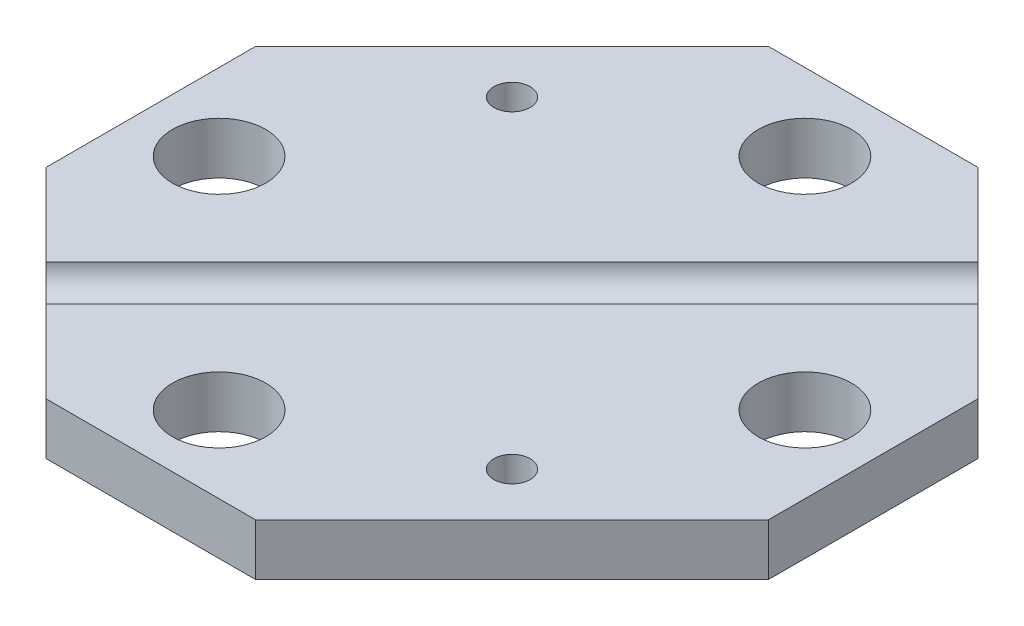
ISO-10303-21;
HEADER;
FILE_DESCRIPTION(('STEP AP214'),'2;1');
FILE_NAME('part.step','',(''),(''),'','','');
FILE_SCHEMA(('AUTOMOTIVE_DESIGN { 1 0 10303 214 1 1 1 1 }'));
ENDSEC;
DATA;
#1=APPLICATION_CONTEXT('core data for automotive mechanical design processes');
#2=APPLICATION_PROTOCOL_DEFINITION('international standard','automotive_design',2000,#1);
#3=PRODUCT_CONTEXT('',#1,'mechanical');
#4=PRODUCT('Part','Part','',(#3));
#5=PRODUCT_RELATED_PRODUCT_CATEGORY('part','',(#4));
#6=PRODUCT_DEFINITION_FORMATION('','',#4);
#7=PRODUCT_DEFINITION_CONTEXT('part definition',#1,'design');
#8=PRODUCT_DEFINITION('design','',#6,#7);
#9=PRODUCT_DEFINITION_SHAPE('','',#8);
#10=(LENGTH_UNIT() NAMED_UNIT(*) SI_UNIT(.MILLI.,.METRE.));
#11=(NAMED_UNIT(*) PLANE_ANGLE_UNIT() SI_UNIT($,.RADIAN.));
#12=(NAMED_UNIT(*) SI_UNIT($,.STERADIAN.) SOLID_ANGLE_UNIT());
#13=UNCERTAINTY_MEASURE_WITH_UNIT(LENGTH_MEASURE(1.E-05),#10,'distance_accuracy_value','');
#14=(GEOMETRIC_REPRESENTATION_CONTEXT(3) GLOBAL_UNCERTAINTY_ASSIGNED_CONTEXT((#13)) GLOBAL_UNIT_ASSIGNED_CONTEXT((#10,
#11,#12)) REPRESENTATION_CONTEXT('',''));
#15=CARTESIAN_POINT('',(0.,0.,0.));
#16=DIRECTION('',(0.,0.,1.));
#17=DIRECTION('',(1.,0.,0.));
#18=AXIS2_PLACEMENT_3D('',#15,#16,#17);
#19=CARTESIAN_POINT('',(0.,5.,0.));
#20=DIRECTION('',(0.,-1.,0.));
#21=DIRECTION('',(0.,0.,-1.));
#22=AXIS2_PLACEMENT_3D('',#19,#20,#21);
#23=PLANE('',#22);
#24=CARTESIAN_POINT('',(-23.6869337565123,5.,-23.6869337565124));
#25=DIRECTION('',(0.,1.,0.));
#26=DIRECTION('',(0.,0.,1.));
#27=AXIS2_PLACEMENT_3D('',#24,#25,#26);
#28=CIRCLE('',#27,1.75000000000001);
#29=CARTESIAN_POINT('',(-23.6869337565123,5.,-21.9369337565123));
#30=VERTEX_POINT('',#29);
#31=EDGE_CURVE('E254',#30,#30,#28,.T.);
#32=ORIENTED_EDGE('',*,*,#31,.F.);
#33=EDGE_LOOP('',(#32));
#34=FACE_BOUND('',#33,.T.);
#35=CARTESIAN_POINT('',(-32.8793219119375,5.,-4.59505066447559));
#36=DIRECTION('',(0.,1.,0.));
#37=DIRECTION('',(0.,0.,1.));
#38=AXIS2_PLACEMENT_3D('',#35,#36,#37);
#39=CIRCLE('',#38,4.5);
#40=CARTESIAN_POINT('',(-32.8793219119375,5.,-0.0950506644755884));
#41=VERTEX_POINT('',#40);
#42=EDGE_CURVE('E274',#41,#41,#39,.T.);
#43=ORIENTED_EDGE('',*,*,#42,.F.);
#44=EDGE_LOOP('',(#43));
#45=FACE_BOUND('',#44,.T.);
#46=CARTESIAN_POINT('',(-4.59505066447554,5.,-32.8793219119374));
#47=DIRECTION('',(0.,1.,0.));
#48=DIRECTION('',(0.,0.,1.));
#49=AXIS2_PLACEMENT_3D('',#46,#47,#48);
#50=CIRCLE('',#49,4.5);
#51=CARTESIAN_POINT('',(-4.59505066447554,5.,-28.3793219119374));
#52=VERTEX_POINT('',#51);
#53=EDGE_CURVE('E280',#52,#52,#50,.T.);
#54=ORIENTED_EDGE('',*,*,#53,.F.);
#55=EDGE_LOOP('',(#54));
#56=FACE_BOUND('',#55,.T.);
#57=DIRECTION('',(0.707106781186547,0.,0.707106781186549));
#58=VECTOR('',#57,1.);
#59=CARTESIAN_POINT('',(-40.3039431143962,5.,4.69479422713291));
#60=LINE('',#59,#58);
#61=CARTESIAN_POINT('',(-40.3039431143962,5.,4.69479422713291));
#62=VERTEX_POINT('',#61);
#63=CARTESIAN_POINT('',(-32.3977201941393,5.,12.6010171473899));
#64=VERTEX_POINT('',#63);
#65=EDGE_CURVE('E303',#62,#64,#60,.T.);
#66=ORIENTED_EDGE('',*,*,#65,.T.);
#67=DIRECTION('',(0.707106781186549,0.,-0.707106781186546));
#68=VECTOR('',#67,1.);
#69=CARTESIAN_POINT('',(-42.0727100673626,5.,22.2760070206132));
#70=LINE('',#69,#68);
#71=CARTESIAN_POINT('',(12.60101714739,5.,-32.3977201941392));
#72=VERTEX_POINT('',#71);
#73=EDGE_CURVE('E269',#64,#72,#70,.T.);
#74=ORIENTED_EDGE('',*,*,#73,.T.);
#75=DIRECTION('',(-0.707106781186546,0.,-0.707106781186549));
#76=VECTOR('',#75,1.);
#77=CARTESIAN_POINT('',(4.69479422713301,5.,-40.3039431143962));
#78=LINE('',#77,#76);
#79=CARTESIAN_POINT('',(4.69479422713301,5.,-40.3039431143962));
#80=VERTEX_POINT('',#79);
#81=EDGE_CURVE('E312',#72,#80,#78,.T.);
#82=ORIENTED_EDGE('',*,*,#81,.T.);
#83=DIRECTION('',(-1.,0.,0.));
#84=VECTOR('',#83,1.);
#85=CARTESIAN_POINT('',(-15.555205772867,5.,-40.3039431143962));
#86=LINE('',#85,#84);
#87=CARTESIAN_POINT('',(-15.555205772867,5.,-40.3039431143962));
#88=VERTEX_POINT('',#87);
#89=EDGE_CURVE('E316',#80,#88,#86,.T.);
#90=ORIENTED_EDGE('',*,*,#89,.T.);
#91=DIRECTION('',(-0.707106781186549,0.,0.707106781186546));
#92=VECTOR('',#91,1.);
#93=CARTESIAN_POINT('',(-40.3039431143962,5.,-15.5552057728671));
#94=LINE('',#93,#92);
#95=CARTESIAN_POINT('',(-40.3039431143962,5.,-15.5552057728671));
#96=VERTEX_POINT('',#95);
#97=EDGE_CURVE('E318',#88,#96,#94,.T.);
#98=ORIENTED_EDGE('',*,*,#97,.T.);
#99=DIRECTION('',(0.,0.,1.));
#100=VECTOR('',#99,1.);
#101=CARTESIAN_POINT('',(-40.3039431143962,5.,-15.5552057728671));
#102=LINE('',#101,#100);
#103=EDGE_CURVE('E298',#96,#62,#102,.T.);
#104=ORIENTED_EDGE('',*,*,#103,.T.);
#105=EDGE_LOOP('',(#66,#74,#82,#90,#98,#104));
#106=FACE_BOUND('',#105,.T.);
#107=ADVANCED_FACE('F45',(#34,#45,#56,#106),#23,.F.);
#108=CARTESIAN_POINT('',(7.42576461569574,5.,7.42576461569574));
#109=DIRECTION('',(0.,1.,0.));
#110=DIRECTION('',(0.,0.,1.));
#111=AXIS2_PLACEMENT_3D('',#108,#109,#110);
#112=CIRCLE('',#111,1.75);
#113=CARTESIAN_POINT('',(7.42576461569574,5.,9.17576461569574));
#114=VERTEX_POINT('',#113);
#115=EDGE_CURVE('E242',#114,#114,#112,.T.);
#116=ORIENTED_EDGE('',*,*,#115,.F.);
#117=EDGE_LOOP('',(#116));
#118=FACE_BOUND('',#117,.T.);
#119=CARTESIAN_POINT('',(24.0427739735796,5.,-20.9559633679495));
#120=VERTEX_POINT('',#119);
#121=CARTESIAN_POINT('',(16.1365510533227,5.,-28.8621862882065));
#122=VERTEX_POINT('',#121);
#123=EDGE_CURVE('E313',#120,#122,#78,.T.);
#124=ORIENTED_EDGE('',*,*,#123,.T.);
#125=DIRECTION('',(0.707106781186549,0.,-0.707106781186546));
#126=VECTOR('',#125,1.);
#127=CARTESIAN_POINT('',(-38.5371761614299,5.,25.8115409265459));
#128=LINE('',#127,#126);
#129=CARTESIAN_POINT('',(-28.8621862882066,5.,16.1365510533226));
#130=VERTEX_POINT('',#129);
#131=EDGE_CURVE('E68',#130,#122,#128,.T.);
#132=ORIENTED_EDGE('',*,*,#131,.F.);
#133=CARTESIAN_POINT('',(-20.9559633679496,5.,24.0427739735796));
#134=VERTEX_POINT('',#133);
#135=EDGE_CURVE('E301',#130,#134,#60,.T.);
#136=ORIENTED_EDGE('',*,*,#135,.T.);
#137=DIRECTION('',(1.,0.,0.));
#138=VECTOR('',#137,1.);
#139=CARTESIAN_POINT('',(-0.705963367949583,5.,24.0427739735796));
#140=LINE('',#139,#138);
#141=CARTESIAN_POINT('',(-0.705963367949583,5.,24.0427739735796));
#142=VERTEX_POINT('',#141);
#143=EDGE_CURVE('E306',#134,#142,#140,.T.);
#144=ORIENTED_EDGE('',*,*,#143,.T.);
#145=DIRECTION('',(0.707106781186549,0.,-0.707106781186546));
#146=VECTOR('',#145,1.);
#147=CARTESIAN_POINT('',(-0.705963367949583,5.,24.0427739735796));
#148=LINE('',#147,#146);
#149=CARTESIAN_POINT('',(24.0427739735796,5.,-0.705963367949539));
#150=VERTEX_POINT('',#149);
#151=EDGE_CURVE('E308',#142,#150,#148,.T.);
#152=ORIENTED_EDGE('',*,*,#151,.T.);
#153=DIRECTION('',(0.,0.,-1.));
#154=VECTOR('',#153,1.);
#155=CARTESIAN_POINT('',(24.0427739735796,5.,-0.705963367949539));
#156=LINE('',#155,#154);
#157=EDGE_CURVE('E310',#150,#120,#156,.T.);
#158=ORIENTED_EDGE('',*,*,#157,.T.);
#159=EDGE_LOOP('',(#124,#132,#136,#144,#152,#158));
#160=FACE_BOUND('',#159,.T.);
#161=CARTESIAN_POINT('',(-11.6661184763411,5.,16.6181527711208));
#162=DIRECTION('',(0.,1.,0.));
#163=DIRECTION('',(0.,0.,1.));
#164=AXIS2_PLACEMENT_3D('',#161,#162,#163);
#165=CIRCLE('',#164,4.5);
#166=CARTESIAN_POINT('',(-11.6661184763411,5.,21.1181527711208));
#167=VERTEX_POINT('',#166);
#168=EDGE_CURVE('E292',#167,#167,#165,.T.);
#169=ORIENTED_EDGE('',*,*,#168,.F.);
#170=EDGE_LOOP('',(#169));
#171=FACE_BOUND('',#170,.T.);
#172=CARTESIAN_POINT('',(16.6181527711209,5.,-11.666118476341));
#173=DIRECTION('',(0.,1.,0.));
#174=DIRECTION('',(0.,0.,1.));
#175=AXIS2_PLACEMENT_3D('',#172,#173,#174);
#176=CIRCLE('',#175,4.5);
#177=CARTESIAN_POINT('',(16.6181527711209,5.,-7.16611847634101));
#178=VERTEX_POINT('',#177);
#179=EDGE_CURVE('E286',#178,#178,#176,.T.);
#180=ORIENTED_EDGE('',*,*,#179,.F.);
#181=EDGE_LOOP('',(#180));
#182=FACE_BOUND('',#181,.T.);
#183=ADVANCED_FACE('F378',(#118,#160,#171,#182),#23,.F.);
#184=CARTESIAN_POINT('',(0.,0.,0.));
#185=DIRECTION('',(0.,-1.,0.));
#186=DIRECTION('',(0.,0.,-1.));
#187=AXIS2_PLACEMENT_3D('',#184,#185,#186);
#188=PLANE('',#187);
#189=CARTESIAN_POINT('',(-8.13058457040829,0.,-8.1305845704083));
#190=DIRECTION('',(0.,-1.,0.));
#191=DIRECTION('',(0.,0.,-1.));
#192=AXIS2_PLACEMENT_3D('',#189,#190,#191);
#193=CIRCLE('',#192,15.25);
#194=CARTESIAN_POINT('',(-21.6157806032452,0.,-1.00934956825038));
#195=VERTEX_POINT('',#194);
#196=CARTESIAN_POINT('',(-1.00934956825027,0.,-21.6157806032453));
#197=VERTEX_POINT('',#196);
#198=EDGE_CURVE('E60',#195,#197,#193,.T.);
#199=ORIENTED_EDGE('',*,*,#198,.F.);
#200=DIRECTION('',(0.387814963572697,0.,-0.921737247825598));
#201=VECTOR('',#200,1.);
#202=CARTESIAN_POINT('',(-18.7255631870612,0.,-7.87865915411335));
#203=LINE('',#202,#201);
#204=CARTESIAN_POINT('',(-23.1566036706224,0.,2.65279384268651));
#205=VERTEX_POINT('',#204);
#206=EDGE_CURVE('E235',#205,#195,#203,.T.);
#207=ORIENTED_EDGE('',*,*,#206,.F.);
#208=CARTESIAN_POINT('',(-21.0352833270628,0.,4.77411418624616));
#209=DIRECTION('',(0.,-1.,0.));
#210=DIRECTION('',(0.,0.,-1.));
#211=AXIS2_PLACEMENT_3D('',#208,#209,#210);
#212=CIRCLE('',#211,3.);
#213=CARTESIAN_POINT('',(-18.9139629835032,0.,6.8954345298058));
#214=VERTEX_POINT('',#213);
#215=EDGE_CURVE('E232',#214,#205,#212,.T.);
#216=ORIENTED_EDGE('',*,*,#215,.F.);
#217=DIRECTION('',(-0.921737247825593,0.,0.387814963572709));
#218=VECTOR('',#217,1.);
#219=CARTESIAN_POINT('',(-0.379802326133202,0.,-0.902693252428207));
#220=LINE('',#219,#218);
#221=CARTESIAN_POINT('',(-15.2518195725663,0.,5.35461146242855));
#222=VERTEX_POINT('',#221);
#223=EDGE_CURVE('E229',#222,#214,#220,.T.);
#224=ORIENTED_EDGE('',*,*,#223,.F.);
#225=CARTESIAN_POINT('',(5.35461146242861,0.,-15.2518195725663));
#226=VERTEX_POINT('',#225);
#227=EDGE_CURVE('E221',#226,#222,#193,.T.);
#228=ORIENTED_EDGE('',*,*,#227,.F.);
#229=DIRECTION('',(0.387814963572699,0.,-0.921737247825597));
#230=VECTOR('',#229,1.);
#231=CARTESIAN_POINT('',(-0.902693252427971,0.,-0.379802326133091));
#232=LINE('',#231,#230);
#233=CARTESIAN_POINT('',(6.89543452980585,0.,-18.9139629835032));
#234=VERTEX_POINT('',#233);
#235=EDGE_CURVE('E226',#226,#234,#232,.T.);
#236=ORIENTED_EDGE('',*,*,#235,.T.);
#237=CARTESIAN_POINT('',(4.77411418624622,0.,-21.0352833270628));
#238=DIRECTION('',(0.,-1.,0.));
#239=DIRECTION('',(0.,0.,-1.));
#240=AXIS2_PLACEMENT_3D('',#237,#238,#239);
#241=CIRCLE('',#240,3.);
#242=CARTESIAN_POINT('',(2.65279384268658,0.,-23.1566036706224));
#243=VERTEX_POINT('',#242);
#244=EDGE_CURVE('E223',#234,#243,#241,.F.);
#245=ORIENTED_EDGE('',*,*,#244,.T.);
#246=DIRECTION('',(-0.9217372478256,0.,0.387814963572693));
#247=VECTOR('',#246,1.);
#248=CARTESIAN_POINT('',(-7.87865915411327,0.,-18.7255631870613));
#249=LINE('',#248,#247);
#250=EDGE_CURVE('E220',#243,#197,#249,.T.);
#251=ORIENTED_EDGE('',*,*,#250,.T.);
#252=EDGE_LOOP('',(#199,#207,#216,#224,#228,#236,#245,#251));
#253=FACE_BOUND('',#252,.T.);
#254=CARTESIAN_POINT('',(-23.6869337565123,0.,-23.6869337565124));
#255=DIRECTION('',(0.,-1.,0.));
#256=DIRECTION('',(0.,0.,-1.));
#257=AXIS2_PLACEMENT_3D('',#254,#255,#256);
#258=CIRCLE('',#257,1.75000000000001);
#259=CARTESIAN_POINT('',(-23.6869337565123,0.,-25.4369337565124));
#260=VERTEX_POINT('',#259);
#261=EDGE_CURVE('E258',#260,#260,#258,.F.);
#262=ORIENTED_EDGE('',*,*,#261,.T.);
#263=EDGE_LOOP('',(#262));
#264=FACE_BOUND('',#263,.T.);
#265=CARTESIAN_POINT('',(7.42576461569574,0.,7.42576461569574));
#266=DIRECTION('',(0.,-1.,0.));
#267=DIRECTION('',(0.,0.,-1.));
#268=AXIS2_PLACEMENT_3D('',#265,#266,#267);
#269=CIRCLE('',#268,1.75);
#270=CARTESIAN_POINT('',(7.42576461569574,0.,5.67576461569573));
#271=VERTEX_POINT('',#270);
#272=EDGE_CURVE('E261',#271,#271,#269,.F.);
#273=ORIENTED_EDGE('',*,*,#272,.T.);
#274=EDGE_LOOP('',(#273));
#275=FACE_BOUND('',#274,.T.);
#276=CARTESIAN_POINT('',(-4.59505066447554,0.,-32.8793219119374));
#277=DIRECTION('',(0.,1.,0.));
#278=DIRECTION('',(0.,0.,1.));
#279=AXIS2_PLACEMENT_3D('',#276,#277,#278);
#280=CIRCLE('',#279,4.5);
#281=CARTESIAN_POINT('',(-4.59505066447554,0.,-28.3793219119374));
#282=VERTEX_POINT('',#281);
#283=EDGE_CURVE('E277',#282,#282,#280,.T.);
#284=ORIENTED_EDGE('',*,*,#283,.T.);
#285=EDGE_LOOP('',(#284));
#286=FACE_BOUND('',#285,.T.);
#287=CARTESIAN_POINT('',(-11.6661184763411,0.,16.6181527711208));
#288=DIRECTION('',(0.,1.,0.));
#289=DIRECTION('',(0.,0.,1.));
#290=AXIS2_PLACEMENT_3D('',#287,#288,#289);
#291=CIRCLE('',#290,4.5);
#292=CARTESIAN_POINT('',(-11.6661184763411,0.,21.1181527711208));
#293=VERTEX_POINT('',#292);
#294=EDGE_CURVE('E289',#293,#293,#291,.T.);
#295=ORIENTED_EDGE('',*,*,#294,.T.);
#296=EDGE_LOOP('',(#295));
#297=FACE_BOUND('',#296,.T.);
#298=DIRECTION('',(0.,0.,1.));
#299=VECTOR('',#298,1.);
#300=CARTESIAN_POINT('',(-40.3039431143962,0.,-15.5552057728671));
#301=LINE('',#300,#299);
#302=CARTESIAN_POINT('',(-40.3039431143962,0.,-15.5552057728671));
#303=VERTEX_POINT('',#302);
#304=CARTESIAN_POINT('',(-40.3039431143962,0.,4.69479422713291));
#305=VERTEX_POINT('',#304);
#306=EDGE_CURVE('E295',#303,#305,#301,.T.);
#307=ORIENTED_EDGE('',*,*,#306,.F.);
#308=DIRECTION('',(-0.707106781186549,0.,0.707106781186546));
#309=VECTOR('',#308,1.);
#310=CARTESIAN_POINT('',(-40.3039431143962,0.,-15.5552057728671));
#311=LINE('',#310,#309);
#312=CARTESIAN_POINT('',(-15.555205772867,0.,-40.3039431143962));
#313=VERTEX_POINT('',#312);
#314=EDGE_CURVE('E302',#313,#303,#311,.T.);
#315=ORIENTED_EDGE('',*,*,#314,.F.);
#316=DIRECTION('',(-1.,0.,0.));
#317=VECTOR('',#316,1.);
#318=CARTESIAN_POINT('',(-15.555205772867,0.,-40.3039431143962));
#319=LINE('',#318,#317);
#320=CARTESIAN_POINT('',(4.69479422713301,0.,-40.3039431143962));
#321=VERTEX_POINT('',#320);
#322=EDGE_CURVE('E333',#321,#313,#319,.T.);
#323=ORIENTED_EDGE('',*,*,#322,.F.);
#324=DIRECTION('',(-0.707106781186546,0.,-0.707106781186549));
#325=VECTOR('',#324,1.);
#326=CARTESIAN_POINT('',(4.69479422713301,0.,-40.3039431143962));
#327=LINE('',#326,#325);
#328=CARTESIAN_POINT('',(24.0427739735796,0.,-20.9559633679495));
#329=VERTEX_POINT('',#328);
#330=EDGE_CURVE('E331',#329,#321,#327,.T.);
#331=ORIENTED_EDGE('',*,*,#330,.F.);
#332=DIRECTION('',(0.,0.,-1.));
#333=VECTOR('',#332,1.);
#334=CARTESIAN_POINT('',(24.0427739735796,0.,-0.705963367949539));
#335=LINE('',#334,#333);
#336=CARTESIAN_POINT('',(24.0427739735796,0.,-0.705963367949539));
#337=VERTEX_POINT('',#336);
#338=EDGE_CURVE('E329',#337,#329,#335,.T.);
#339=ORIENTED_EDGE('',*,*,#338,.F.);
#340=DIRECTION('',(0.707106781186549,0.,-0.707106781186546));
#341=VECTOR('',#340,1.);
#342=CARTESIAN_POINT('',(-0.705963367949583,0.,24.0427739735796));
#343=LINE('',#342,#341);
#344=CARTESIAN_POINT('',(-0.705963367949583,0.,24.0427739735796));
#345=VERTEX_POINT('',#344);
#346=EDGE_CURVE('E327',#345,#337,#343,.T.);
#347=ORIENTED_EDGE('',*,*,#346,.F.);
#348=DIRECTION('',(1.,0.,0.));
#349=VECTOR('',#348,1.);
#350=CARTESIAN_POINT('',(-0.705963367949583,0.,24.0427739735796));
#351=LINE('',#350,#349);
#352=CARTESIAN_POINT('',(-20.9559633679496,0.,24.0427739735796));
#353=VERTEX_POINT('',#352);
#354=EDGE_CURVE('E325',#353,#345,#351,.T.);
#355=ORIENTED_EDGE('',*,*,#354,.F.);
#356=DIRECTION('',(0.707106781186547,0.,0.707106781186549));
#357=VECTOR('',#356,1.);
#358=CARTESIAN_POINT('',(-40.3039431143962,0.,4.69479422713291));
#359=LINE('',#358,#357);
#360=EDGE_CURVE('E323',#305,#353,#359,.T.);
#361=ORIENTED_EDGE('',*,*,#360,.F.);
#362=EDGE_LOOP('',(#307,#315,#323,#331,#339,#347,#355,#361));
#363=FACE_BOUND('',#362,.T.);
#364=CARTESIAN_POINT('',(16.6181527711209,0.,-11.666118476341));
#365=DIRECTION('',(0.,1.,0.));
#366=DIRECTION('',(0.,0.,1.));
#367=AXIS2_PLACEMENT_3D('',#364,#365,#366);
#368=CIRCLE('',#367,4.5);
#369=CARTESIAN_POINT('',(16.6181527711209,0.,-7.16611847634101));
#370=VERTEX_POINT('',#369);
#371=EDGE_CURVE('E283',#370,#370,#368,.T.);
#372=ORIENTED_EDGE('',*,*,#371,.T.);
#373=EDGE_LOOP('',(#372));
#374=FACE_BOUND('',#373,.T.);
#375=CARTESIAN_POINT('',(-32.8793219119375,0.,-4.59505066447559));
#376=DIRECTION('',(0.,1.,0.));
#377=DIRECTION('',(0.,0.,1.));
#378=AXIS2_PLACEMENT_3D('',#375,#376,#377);
#379=CIRCLE('',#378,4.5);
#380=CARTESIAN_POINT('',(-32.8793219119375,0.,-0.0950506644755884));
#381=VERTEX_POINT('',#380);
#382=EDGE_CURVE('E271',#381,#381,#379,.T.);
#383=ORIENTED_EDGE('',*,*,#382,.T.);
#384=EDGE_LOOP('',(#383));
#385=FACE_BOUND('',#384,.T.);
#386=ADVANCED_FACE('F364',(#253,#264,#275,#286,#297,#363,#374,#385),#188,.T.);
#387=CARTESIAN_POINT('',(-40.3039431143962,5.,-15.5552057728671));
#388=DIRECTION('',(1.,0.,0.));
#389=DIRECTION('',(0.,0.,-1.));
#390=AXIS2_PLACEMENT_3D('',#387,#388,#389);
#391=PLANE('',#390);
#392=ORIENTED_EDGE('',*,*,#306,.T.);
#393=DIRECTION('',(0.,-1.,0.));
#394=VECTOR('',#393,1.);
#395=CARTESIAN_POINT('',(-40.3039431143962,5.,4.69479422713291));
#396=LINE('',#395,#394);
#397=EDGE_CURVE('E11',#62,#305,#396,.T.);
#398=ORIENTED_EDGE('',*,*,#397,.F.);
#399=ORIENTED_EDGE('',*,*,#103,.F.);
#400=DIRECTION('',(0.,-1.,0.));
#401=VECTOR('',#400,1.);
#402=CARTESIAN_POINT('',(-40.3039431143962,5.,-15.5552057728671));
#403=LINE('',#402,#401);
#404=EDGE_CURVE('E320',#96,#303,#403,.T.);
#405=ORIENTED_EDGE('',*,*,#404,.T.);
#406=EDGE_LOOP('',(#392,#398,#399,#405));
#407=FACE_BOUND('',#406,.T.);
#408=ADVANCED_FACE('F47',(#407),#391,.F.);
#409=CARTESIAN_POINT('',(-40.3039431143962,5.,4.69479422713291));
#410=DIRECTION('',(0.707106781186548,0.,-0.707106781186547));
#411=DIRECTION('',(-0.707106781186547,0.,-0.707106781186548));
#412=AXIS2_PLACEMENT_3D('',#409,#410,#411);
#413=PLANE('',#412);
#414=ORIENTED_EDGE('',*,*,#135,.F.);
#415=CARTESIAN_POINT('',(-30.6299532411729,5.,14.3687841003562));
#416=DIRECTION('',(0.707106781186548,0.,-0.707106781186547));
#417=DIRECTION('',(-0.707106781186547,0.,-0.707106781186548));
#418=AXIS2_PLACEMENT_3D('',#415,#416,#417);
#419=CIRCLE('',#418,2.5);
#420=EDGE_CURVE('E257',#64,#130,#419,.F.);
#421=ORIENTED_EDGE('',*,*,#420,.F.);
#422=ORIENTED_EDGE('',*,*,#65,.F.);
#423=ORIENTED_EDGE('',*,*,#397,.T.);
#424=ORIENTED_EDGE('',*,*,#360,.T.);
#425=DIRECTION('',(0.,-1.,0.));
#426=VECTOR('',#425,1.);
#427=CARTESIAN_POINT('',(-20.9559633679496,5.,24.0427739735796));
#428=LINE('',#427,#426);
#429=EDGE_CURVE('E53',#134,#353,#428,.T.);
#430=ORIENTED_EDGE('',*,*,#429,.F.);
#431=EDGE_LOOP('',(#414,#421,#422,#423,#424,#430));
#432=FACE_BOUND('',#431,.T.);
#433=ADVANCED_FACE('F381',(#432),#413,.F.);
#434=CARTESIAN_POINT('',(-0.705963367949583,5.,24.0427739735796));
#435=DIRECTION('',(0.,0.,-1.));
#436=DIRECTION('',(-1.,0.,0.));
#437=AXIS2_PLACEMENT_3D('',#434,#435,#436);
#438=PLANE('',#437);
#439=ORIENTED_EDGE('',*,*,#354,.T.);
#440=DIRECTION('',(0.,-1.,0.));
#441=VECTOR('',#440,1.);
#442=CARTESIAN_POINT('',(-0.705963367949583,5.,24.0427739735796));
#443=LINE('',#442,#441);
#444=EDGE_CURVE('E350',#142,#345,#443,.T.);
#445=ORIENTED_EDGE('',*,*,#444,.F.);
#446=ORIENTED_EDGE('',*,*,#143,.F.);
#447=ORIENTED_EDGE('',*,*,#429,.T.);
#448=EDGE_LOOP('',(#439,#445,#446,#447));
#449=FACE_BOUND('',#448,.T.);
#450=ADVANCED_FACE('F357',(#449),#438,.F.);
#451=CARTESIAN_POINT('',(-0.705963367949583,5.,24.0427739735796));
#452=DIRECTION('',(-0.707106781186546,0.,-0.707106781186549));
#453=DIRECTION('',(-0.707106781186549,0.,0.707106781186546));
#454=AXIS2_PLACEMENT_3D('',#451,#452,#453);
#455=PLANE('',#454);
#456=ORIENTED_EDGE('',*,*,#346,.T.);
#457=DIRECTION('',(0.,-1.,0.));
#458=VECTOR('',#457,1.);
#459=CARTESIAN_POINT('',(24.0427739735796,5.,-0.705963367949539));
#460=LINE('',#459,#458);
#461=EDGE_CURVE('E347',#150,#337,#460,.T.);
#462=ORIENTED_EDGE('',*,*,#461,.F.);
#463=ORIENTED_EDGE('',*,*,#151,.F.);
#464=ORIENTED_EDGE('',*,*,#444,.T.);
#465=EDGE_LOOP('',(#456,#462,#463,#464));
#466=FACE_BOUND('',#465,.T.);
#467=ADVANCED_FACE('F370',(#466),#455,.F.);
#468=CARTESIAN_POINT('',(24.0427739735796,5.,-0.705963367949539));
#469=DIRECTION('',(-1.,0.,0.));
#470=DIRECTION('',(0.,0.,1.));
#471=AXIS2_PLACEMENT_3D('',#468,#469,#470);
#472=PLANE('',#471);
#473=ORIENTED_EDGE('',*,*,#338,.T.);
#474=DIRECTION('',(0.,-1.,0.));
#475=VECTOR('',#474,1.);
#476=CARTESIAN_POINT('',(24.0427739735796,5.,-20.9559633679495));
#477=LINE('',#476,#475);
#478=EDGE_CURVE('E344',#120,#329,#477,.T.);
#479=ORIENTED_EDGE('',*,*,#478,.F.);
#480=ORIENTED_EDGE('',*,*,#157,.F.);
#481=ORIENTED_EDGE('',*,*,#461,.T.);
#482=EDGE_LOOP('',(#473,#479,#480,#481));
#483=FACE_BOUND('',#482,.T.);
#484=ADVANCED_FACE('F374',(#483),#472,.F.);
#485=CARTESIAN_POINT('',(4.69479422713301,5.,-40.3039431143962));
#486=DIRECTION('',(-0.707106781186549,0.,0.707106781186546));
#487=DIRECTION('',(0.707106781186546,0.,0.707106781186549));
#488=AXIS2_PLACEMENT_3D('',#485,#486,#487);
#489=PLANE('',#488);
#490=ORIENTED_EDGE('',*,*,#81,.F.);
#491=CARTESIAN_POINT('',(14.3687841003563,5.,-30.6299532411729));
#492=DIRECTION('',(0.707106781186549,0.,-0.707106781186546));
#493=DIRECTION('',(-0.707106781186546,0.,-0.707106781186549));
#494=AXIS2_PLACEMENT_3D('',#491,#492,#493);
#495=CIRCLE('',#494,2.5);
#496=EDGE_CURVE('E267',#122,#72,#495,.T.);
#497=ORIENTED_EDGE('',*,*,#496,.F.);
#498=ORIENTED_EDGE('',*,*,#123,.F.);
#499=ORIENTED_EDGE('',*,*,#478,.T.);
#500=ORIENTED_EDGE('',*,*,#330,.T.);
#501=DIRECTION('',(0.,-1.,0.));
#502=VECTOR('',#501,1.);
#503=CARTESIAN_POINT('',(4.69479422713301,5.,-40.3039431143962));
#504=LINE('',#503,#502);
#505=EDGE_CURVE('E341',#80,#321,#504,.T.);
#506=ORIENTED_EDGE('',*,*,#505,.F.);
#507=EDGE_LOOP('',(#490,#497,#498,#499,#500,#506));
#508=FACE_BOUND('',#507,.T.);
#509=ADVANCED_FACE('F399',(#508),#489,.F.);
#510=CARTESIAN_POINT('',(-15.555205772867,5.,-40.3039431143962));
#511=DIRECTION('',(0.,0.,1.));
#512=DIRECTION('',(1.,0.,0.));
#513=AXIS2_PLACEMENT_3D('',#510,#511,#512);
#514=PLANE('',#513);
#515=ORIENTED_EDGE('',*,*,#322,.T.);
#516=DIRECTION('',(0.,-1.,0.));
#517=VECTOR('',#516,1.);
#518=CARTESIAN_POINT('',(-15.555205772867,5.,-40.3039431143962));
#519=LINE('',#518,#517);
#520=EDGE_CURVE('E338',#88,#313,#519,.T.);
#521=ORIENTED_EDGE('',*,*,#520,.F.);
#522=ORIENTED_EDGE('',*,*,#89,.F.);
#523=ORIENTED_EDGE('',*,*,#505,.T.);
#524=EDGE_LOOP('',(#515,#521,#522,#523));
#525=FACE_BOUND('',#524,.T.);
#526=ADVANCED_FACE('F396',(#525),#514,.F.);
#527=CARTESIAN_POINT('',(-40.3039431143962,5.,-15.5552057728671));
#528=DIRECTION('',(0.707106781186546,0.,0.707106781186549));
#529=DIRECTION('',(0.707106781186549,0.,-0.707106781186546));
#530=AXIS2_PLACEMENT_3D('',#527,#528,#529);
#531=PLANE('',#530);
#532=ORIENTED_EDGE('',*,*,#314,.T.);
#533=ORIENTED_EDGE('',*,*,#404,.F.);
#534=ORIENTED_EDGE('',*,*,#97,.F.);
#535=ORIENTED_EDGE('',*,*,#520,.T.);
#536=EDGE_LOOP('',(#532,#533,#534,#535));
#537=FACE_BOUND('',#536,.T.);
#538=ADVANCED_FACE('F392',(#537),#531,.F.);
#539=CARTESIAN_POINT('',(-11.6661184763411,5.,16.6181527711208));
#540=DIRECTION('',(0.,-1.,0.));
#541=DIRECTION('',(0.,0.,-1.));
#542=AXIS2_PLACEMENT_3D('',#539,#540,#541);
#543=CYLINDRICAL_SURFACE('',#542,4.5);
#544=ORIENTED_EDGE('',*,*,#168,.T.);
#545=EDGE_LOOP('',(#544));
#546=FACE_BOUND('',#545,.T.);
#547=ORIENTED_EDGE('',*,*,#294,.F.);
#548=EDGE_LOOP('',(#547));
#549=FACE_BOUND('',#548,.T.);
#550=ADVANCED_FACE('F427',(#546,#549),#543,.F.);
#551=CARTESIAN_POINT('',(16.6181527711209,5.,-11.666118476341));
#552=DIRECTION('',(0.,-1.,0.));
#553=DIRECTION('',(0.,0.,-1.));
#554=AXIS2_PLACEMENT_3D('',#551,#552,#553);
#555=CYLINDRICAL_SURFACE('',#554,4.5);
#556=ORIENTED_EDGE('',*,*,#179,.T.);
#557=EDGE_LOOP('',(#556));
#558=FACE_BOUND('',#557,.T.);
#559=ORIENTED_EDGE('',*,*,#371,.F.);
#560=EDGE_LOOP('',(#559));
#561=FACE_BOUND('',#560,.T.);
#562=ADVANCED_FACE('F484',(#558,#561),#555,.F.);
#563=CARTESIAN_POINT('',(-4.59505066447554,5.,-32.8793219119374));
#564=DIRECTION('',(0.,-1.,0.));
#565=DIRECTION('',(0.,0.,-1.));
#566=AXIS2_PLACEMENT_3D('',#563,#564,#565);
#567=CYLINDRICAL_SURFACE('',#566,4.5);
#568=ORIENTED_EDGE('',*,*,#53,.T.);
#569=EDGE_LOOP('',(#568));
#570=FACE_BOUND('',#569,.T.);
#571=ORIENTED_EDGE('',*,*,#283,.F.);
#572=EDGE_LOOP('',(#571));
#573=FACE_BOUND('',#572,.T.);
#574=ADVANCED_FACE('F414',(#570,#573),#567,.F.);
#575=CARTESIAN_POINT('',(-32.8793219119375,5.,-4.59505066447559));
#576=DIRECTION('',(0.,-1.,0.));
#577=DIRECTION('',(0.,0.,-1.));
#578=AXIS2_PLACEMENT_3D('',#575,#576,#577);
#579=CYLINDRICAL_SURFACE('',#578,4.5);
#580=ORIENTED_EDGE('',*,*,#42,.T.);
#581=EDGE_LOOP('',(#580));
#582=FACE_BOUND('',#581,.T.);
#583=ORIENTED_EDGE('',*,*,#382,.F.);
#584=EDGE_LOOP('',(#583));
#585=FACE_BOUND('',#584,.T.);
#586=ADVANCED_FACE('F403',(#582,#585),#579,.F.);
#587=CARTESIAN_POINT('',(-40.3049431143963,5.,24.0437739735795));
#588=DIRECTION('',(0.707106781186549,0.,-0.707106781186546));
#589=DIRECTION('',(-0.707106781186546,0.,-0.707106781186549));
#590=AXIS2_PLACEMENT_3D('',#587,#588,#589);
#591=CYLINDRICAL_SURFACE('',#590,2.5);
#592=ORIENTED_EDGE('',*,*,#420,.T.);
#593=ORIENTED_EDGE('',*,*,#131,.T.);
#594=ORIENTED_EDGE('',*,*,#496,.T.);
#595=ORIENTED_EDGE('',*,*,#73,.F.);
#596=EDGE_LOOP('',(#592,#593,#594,#595));
#597=FACE_BOUND('',#596,.T.);
#598=ADVANCED_FACE('F400',(#597),#591,.F.);
#599=CARTESIAN_POINT('',(7.42576461569574,-0.00100000000000013,7.42576461569574));
#600=DIRECTION('',(0.,1.,0.));
#601=DIRECTION('',(0.,0.,1.));
#602=AXIS2_PLACEMENT_3D('',#599,#600,#601);
#603=CYLINDRICAL_SURFACE('',#602,1.75);
#604=ORIENTED_EDGE('',*,*,#272,.F.);
#605=EDGE_LOOP('',(#604));
#606=FACE_BOUND('',#605,.T.);
#607=ORIENTED_EDGE('',*,*,#115,.T.);
#608=EDGE_LOOP('',(#607));
#609=FACE_BOUND('',#608,.T.);
#610=ADVANCED_FACE('F402',(#606,#609),#603,.F.);
#611=CARTESIAN_POINT('',(-23.6869337565123,-0.00100000000000013,-23.6869337565124));
#612=DIRECTION('',(0.,1.,0.));
#613=DIRECTION('',(0.,0.,1.));
#614=AXIS2_PLACEMENT_3D('',#611,#612,#613);
#615=CYLINDRICAL_SURFACE('',#614,1.75000000000001);
#616=ORIENTED_EDGE('',*,*,#261,.F.);
#617=EDGE_LOOP('',(#616));
#618=FACE_BOUND('',#617,.T.);
#619=ORIENTED_EDGE('',*,*,#31,.T.);
#620=EDGE_LOOP('',(#619));
#621=FACE_BOUND('',#620,.T.);
#622=ADVANCED_FACE('F410',(#618,#621),#615,.F.);
#623=CARTESIAN_POINT('',(-8.13058457040829,0.5,-8.1305845704083));
#624=DIRECTION('',(0.,-1.,0.));
#625=DIRECTION('',(0.,0.,-1.));
#626=AXIS2_PLACEMENT_3D('',#623,#624,#625);
#627=CYLINDRICAL_SURFACE('',#626,15.25);
#628=ORIENTED_EDGE('',*,*,#198,.T.);
#629=DIRECTION('',(0.,-1.,0.));
#630=VECTOR('',#629,1.);
#631=CARTESIAN_POINT('',(-1.00934956825027,0.5,-21.6157806032452));
#632=LINE('',#631,#630);
#633=CARTESIAN_POINT('',(-1.00934956825027,0.5,-21.6157806032452));
#634=VERTEX_POINT('',#633);
#635=EDGE_CURVE('E174',#634,#197,#632,.T.);
#636=ORIENTED_EDGE('',*,*,#635,.F.);
#637=CARTESIAN_POINT('',(-8.13058457040829,0.5,-8.1305845704083));
#638=DIRECTION('',(0.,-1.,0.));
#639=DIRECTION('',(0.,0.,-1.));
#640=AXIS2_PLACEMENT_3D('',#637,#638,#639);
#641=CIRCLE('',#640,15.25);
#642=CARTESIAN_POINT('',(-21.6157806032452,0.5,-1.00934956825038));
#643=VERTEX_POINT('',#642);
#644=EDGE_CURVE('E181',#643,#634,#641,.T.);
#645=ORIENTED_EDGE('',*,*,#644,.F.);
#646=DIRECTION('',(0.,-1.,0.));
#647=VECTOR('',#646,1.);
#648=CARTESIAN_POINT('',(-21.6157806032452,0.5,-1.00934956825038));
#649=LINE('',#648,#647);
#650=EDGE_CURVE('E240',#643,#195,#649,.T.);
#651=ORIENTED_EDGE('',*,*,#650,.T.);
#652=EDGE_LOOP('',(#628,#636,#645,#651));
#653=FACE_BOUND('',#652,.T.);
#654=ADVANCED_FACE('F184',(#653),#627,.F.);
#655=CARTESIAN_POINT('',(-18.7255631870612,0.5,-7.87865915411335));
#656=DIRECTION('',(-0.921737247825598,0.,-0.387814963572697));
#657=DIRECTION('',(-0.387814963572697,0.,0.921737247825598));
#658=AXIS2_PLACEMENT_3D('',#655,#656,#657);
#659=PLANE('',#658);
#660=ORIENTED_EDGE('',*,*,#206,.T.);
#661=ORIENTED_EDGE('',*,*,#650,.F.);
#662=DIRECTION('',(0.387814963572697,0.,-0.921737247825598));
#663=VECTOR('',#662,1.);
#664=CARTESIAN_POINT('',(-18.7255631870612,0.5,-7.87865915411335));
#665=LINE('',#664,#663);
#666=CARTESIAN_POINT('',(-23.1566036706224,0.5,2.65279384268651));
#667=VERTEX_POINT('',#666);
#668=EDGE_CURVE('E192',#667,#643,#665,.T.);
#669=ORIENTED_EDGE('',*,*,#668,.F.);
#670=DIRECTION('',(0.,-1.,0.));
#671=VECTOR('',#670,1.);
#672=CARTESIAN_POINT('',(-23.1566036706224,0.5,2.65279384268651));
#673=LINE('',#672,#671);
#674=EDGE_CURVE('E243',#667,#205,#673,.T.);
#675=ORIENTED_EDGE('',*,*,#674,.T.);
#676=EDGE_LOOP('',(#660,#661,#669,#675));
#677=FACE_BOUND('',#676,.T.);
#678=ADVANCED_FACE('F552',(#677),#659,.F.);
#679=CARTESIAN_POINT('',(-21.0352833270628,0.5,4.77411418624616));
#680=DIRECTION('',(0.,-1.,0.));
#681=DIRECTION('',(0.,0.,-1.));
#682=AXIS2_PLACEMENT_3D('',#679,#680,#681);
#683=CYLINDRICAL_SURFACE('',#682,3.);
#684=ORIENTED_EDGE('',*,*,#215,.T.);
#685=ORIENTED_EDGE('',*,*,#674,.F.);
#686=CARTESIAN_POINT('',(-21.0352833270628,0.5,4.77411418624616));
#687=DIRECTION('',(0.,-1.,0.));
#688=DIRECTION('',(0.,0.,-1.));
#689=AXIS2_PLACEMENT_3D('',#686,#687,#688);
#690=CIRCLE('',#689,3.);
#691=CARTESIAN_POINT('',(-18.9139629835032,0.5,6.8954345298058));
#692=VERTEX_POINT('',#691);
#693=EDGE_CURVE('E205',#692,#667,#690,.T.);
#694=ORIENTED_EDGE('',*,*,#693,.F.);
#695=DIRECTION('',(0.,-1.,0.));
#696=VECTOR('',#695,1.);
#697=CARTESIAN_POINT('',(-18.9139629835032,0.5,6.8954345298058));
#698=LINE('',#697,#696);
#699=EDGE_CURVE('E245',#692,#214,#698,.T.);
#700=ORIENTED_EDGE('',*,*,#699,.T.);
#701=EDGE_LOOP('',(#684,#685,#694,#700));
#702=FACE_BOUND('',#701,.T.);
#703=ADVANCED_FACE('F562',(#702),#683,.F.);
#704=CARTESIAN_POINT('',(-0.379802326133202,0.5,-0.902693252428207));
#705=DIRECTION('',(0.387814963572709,0.,0.921737247825593));
#706=DIRECTION('',(0.921737247825593,0.,-0.38781496357271));
#707=AXIS2_PLACEMENT_3D('',#704,#705,#706);
#708=PLANE('',#707);
#709=ORIENTED_EDGE('',*,*,#223,.T.);
#710=ORIENTED_EDGE('',*,*,#699,.F.);
#711=DIRECTION('',(-0.921737247825593,0.,0.387814963572709));
#712=VECTOR('',#711,1.);
#713=CARTESIAN_POINT('',(-0.379802326133202,0.5,-0.902693252428207));
#714=LINE('',#713,#712);
#715=CARTESIAN_POINT('',(-15.2518195725663,0.5,5.35461146242855));
#716=VERTEX_POINT('',#715);
#717=EDGE_CURVE('E200',#716,#692,#714,.T.);
#718=ORIENTED_EDGE('',*,*,#717,.F.);
#719=DIRECTION('',(0.,-1.,0.));
#720=VECTOR('',#719,1.);
#721=CARTESIAN_POINT('',(-15.2518195725663,0.5,5.35461146242855));
#722=LINE('',#721,#720);
#723=EDGE_CURVE('E247',#716,#222,#722,.T.);
#724=ORIENTED_EDGE('',*,*,#723,.T.);
#725=EDGE_LOOP('',(#709,#710,#718,#724));
#726=FACE_BOUND('',#725,.T.);
#727=ADVANCED_FACE('F572',(#726),#708,.F.);
#728=ORIENTED_EDGE('',*,*,#227,.T.);
#729=ORIENTED_EDGE('',*,*,#723,.F.);
#730=CARTESIAN_POINT('',(5.35461146242861,0.5,-15.2518195725663));
#731=VERTEX_POINT('',#730);
#732=EDGE_CURVE('E195',#731,#716,#641,.T.);
#733=ORIENTED_EDGE('',*,*,#732,.F.);
#734=DIRECTION('',(0.,-1.,0.));
#735=VECTOR('',#734,1.);
#736=CARTESIAN_POINT('',(5.35461146242861,0.5,-15.2518195725663));
#737=LINE('',#736,#735);
#738=EDGE_CURVE('E249',#731,#226,#737,.T.);
#739=ORIENTED_EDGE('',*,*,#738,.T.);
#740=EDGE_LOOP('',(#728,#729,#733,#739));
#741=FACE_BOUND('',#740,.T.);
#742=ADVANCED_FACE('F554',(#741),#627,.F.);
#743=CARTESIAN_POINT('',(-0.902693252427971,0.5,-0.379802326133091));
#744=DIRECTION('',(-0.921737247825597,0.,-0.387814963572699));
#745=DIRECTION('',(-0.387814963572699,0.,0.921737247825597));
#746=AXIS2_PLACEMENT_3D('',#743,#744,#745);
#747=PLANE('',#746);
#748=ORIENTED_EDGE('',*,*,#235,.F.);
#749=ORIENTED_EDGE('',*,*,#738,.F.);
#750=DIRECTION('',(0.387814963572699,0.,-0.921737247825597));
#751=VECTOR('',#750,1.);
#752=CARTESIAN_POINT('',(-0.902693252427971,0.5,-0.379802326133091));
#753=LINE('',#752,#751);
#754=CARTESIAN_POINT('',(6.89543452980585,0.5,-18.9139629835032));
#755=VERTEX_POINT('',#754);
#756=EDGE_CURVE('E201',#731,#755,#753,.T.);
#757=ORIENTED_EDGE('',*,*,#756,.T.);
#758=DIRECTION('',(0.,-1.,0.));
#759=VECTOR('',#758,1.);
#760=CARTESIAN_POINT('',(6.89543452980585,0.5,-18.9139629835032));
#761=LINE('',#760,#759);
#762=EDGE_CURVE('E251',#755,#234,#761,.T.);
#763=ORIENTED_EDGE('',*,*,#762,.T.);
#764=EDGE_LOOP('',(#748,#749,#757,#763));
#765=FACE_BOUND('',#764,.T.);
#766=ADVANCED_FACE('F591',(#765),#747,.T.);
#767=CARTESIAN_POINT('',(4.77411418624622,0.5,-21.0352833270628));
#768=DIRECTION('',(0.,-1.,0.));
#769=DIRECTION('',(0.,0.,-1.));
#770=AXIS2_PLACEMENT_3D('',#767,#768,#769);
#771=CYLINDRICAL_SURFACE('',#770,3.);
#772=ORIENTED_EDGE('',*,*,#244,.F.);
#773=ORIENTED_EDGE('',*,*,#762,.F.);
#774=CARTESIAN_POINT('',(4.77411418624622,0.5,-21.0352833270628));
#775=DIRECTION('',(0.,-1.,0.));
#776=DIRECTION('',(0.,0.,-1.));
#777=AXIS2_PLACEMENT_3D('',#774,#775,#776);
#778=CIRCLE('',#777,3.);
#779=CARTESIAN_POINT('',(2.65279384268658,0.5,-23.1566036706224));
#780=VERTEX_POINT('',#779);
#781=EDGE_CURVE('E180',#755,#780,#778,.F.);
#782=ORIENTED_EDGE('',*,*,#781,.T.);
#783=DIRECTION('',(0.,-1.,0.));
#784=VECTOR('',#783,1.);
#785=CARTESIAN_POINT('',(2.65279384268658,0.5,-23.1566036706224));
#786=LINE('',#785,#784);
#787=EDGE_CURVE('E176',#780,#243,#786,.T.);
#788=ORIENTED_EDGE('',*,*,#787,.T.);
#789=EDGE_LOOP('',(#772,#773,#782,#788));
#790=FACE_BOUND('',#789,.T.);
#791=ADVANCED_FACE('F600',(#790),#771,.F.);
#792=CARTESIAN_POINT('',(-21.0352833270628,0.5,4.77411418624616));
#793=DIRECTION('',(0.,-1.,0.));
#794=DIRECTION('',(0.,0.,-1.));
#795=AXIS2_PLACEMENT_3D('',#792,#793,#794);
#796=CYLINDRICAL_SURFACE('',#795,0.950000000000001);
#797=CARTESIAN_POINT('',(-21.0352833270628,0.5,4.77411418624616));
#798=DIRECTION('',(0.,-1.,0.));
#799=DIRECTION('',(0.,0.,-1.));
#800=AXIS2_PLACEMENT_3D('',#797,#798,#799);
#801=CIRCLE('',#800,0.950000000000001);
#802=CARTESIAN_POINT('',(-21.0352833270628,0.5,3.82411418624616));
#803=VERTEX_POINT('',#802);
#804=EDGE_CURVE('E214',#803,#803,#801,.F.);
#805=ORIENTED_EDGE('',*,*,#804,.F.);
#806=EDGE_LOOP('',(#805));
#807=FACE_BOUND('',#806,.T.);
#808=CARTESIAN_POINT('',(-21.0352833270628,0.,4.77411418624616));
#809=DIRECTION('',(0.,-1.,0.));
#810=DIRECTION('',(0.,0.,-1.));
#811=AXIS2_PLACEMENT_3D('',#808,#809,#810);
#812=CIRCLE('',#811,0.950000000000001);
#813=CARTESIAN_POINT('',(-21.0352833270628,0.,3.82411418624616));
#814=VERTEX_POINT('',#813);
#815=EDGE_CURVE('E197',#814,#814,#812,.F.);
#816=ORIENTED_EDGE('',*,*,#815,.T.);
#817=EDGE_LOOP('',(#816));
#818=FACE_BOUND('',#817,.T.);
#819=ADVANCED_FACE('F609',(#807,#818),#796,.T.);
#820=CARTESIAN_POINT('',(-7.87865915411327,0.5,-18.7255631870613));
#821=DIRECTION('',(0.387814963572693,0.,0.9217372478256));
#822=DIRECTION('',(0.9217372478256,0.,-0.387814963572693));
#823=AXIS2_PLACEMENT_3D('',#820,#821,#822);
#824=PLANE('',#823);
#825=ORIENTED_EDGE('',*,*,#250,.F.);
#826=ORIENTED_EDGE('',*,*,#787,.F.);
#827=DIRECTION('',(-0.9217372478256,0.,0.387814963572693));
#828=VECTOR('',#827,1.);
#829=CARTESIAN_POINT('',(-7.87865915411327,0.5,-18.7255631870613));
#830=LINE('',#829,#828);
#831=EDGE_CURVE('E171',#780,#634,#830,.T.);
#832=ORIENTED_EDGE('',*,*,#831,.T.);
#833=ORIENTED_EDGE('',*,*,#635,.T.);
#834=EDGE_LOOP('',(#825,#826,#832,#833));
#835=FACE_BOUND('',#834,.T.);
#836=ADVANCED_FACE('F173',(#835),#824,.T.);
#837=CARTESIAN_POINT('',(4.77411418624621,0.5,-21.0352833270628));
#838=DIRECTION('',(0.,-1.,0.));
#839=DIRECTION('',(0.,0.,-1.));
#840=AXIS2_PLACEMENT_3D('',#837,#838,#839);
#841=CYLINDRICAL_SURFACE('',#840,0.95);
#842=CARTESIAN_POINT('',(4.77411418624621,0.5,-21.0352833270628));
#843=DIRECTION('',(0.,-1.,0.));
#844=DIRECTION('',(0.,0.,-1.));
#845=AXIS2_PLACEMENT_3D('',#842,#843,#844);
#846=CIRCLE('',#845,0.95);
#847=CARTESIAN_POINT('',(4.77411418624621,0.5,-21.9852833270628));
#848=VERTEX_POINT('',#847);
#849=EDGE_CURVE('E186',#848,#848,#846,.T.);
#850=ORIENTED_EDGE('',*,*,#849,.T.);
#851=EDGE_LOOP('',(#850));
#852=FACE_BOUND('',#851,.T.);
#853=CARTESIAN_POINT('',(4.77411418624621,0.,-21.0352833270628));
#854=DIRECTION('',(0.,-1.,0.));
#855=DIRECTION('',(0.,0.,-1.));
#856=AXIS2_PLACEMENT_3D('',#853,#854,#855);
#857=CIRCLE('',#856,0.95);
#858=CARTESIAN_POINT('',(4.77411418624621,0.,-21.9852833270628));
#859=VERTEX_POINT('',#858);
#860=EDGE_CURVE('E193',#859,#859,#857,.T.);
#861=ORIENTED_EDGE('',*,*,#860,.F.);
#862=EDGE_LOOP('',(#861));
#863=FACE_BOUND('',#862,.T.);
#864=ADVANCED_FACE('F628',(#852,#863),#841,.T.);
#865=CARTESIAN_POINT('',(0.,0.5,0.));
#866=DIRECTION('',(0.,-1.,0.));
#867=DIRECTION('',(0.,0.,-1.));
#868=AXIS2_PLACEMENT_3D('',#865,#866,#867);
#869=PLANE('',#868);
#870=ORIENTED_EDGE('',*,*,#644,.T.);
#871=ORIENTED_EDGE('',*,*,#831,.F.);
#872=ORIENTED_EDGE('',*,*,#781,.F.);
#873=ORIENTED_EDGE('',*,*,#756,.F.);
#874=ORIENTED_EDGE('',*,*,#732,.T.);
#875=ORIENTED_EDGE('',*,*,#717,.T.);
#876=ORIENTED_EDGE('',*,*,#693,.T.);
#877=ORIENTED_EDGE('',*,*,#668,.T.);
#878=EDGE_LOOP('',(#870,#871,#872,#873,#874,#875,#876,#877));
#879=FACE_BOUND('',#878,.T.);
#880=ORIENTED_EDGE('',*,*,#804,.T.);
#881=EDGE_LOOP('',(#880));
#882=FACE_BOUND('',#881,.T.);
#883=ORIENTED_EDGE('',*,*,#849,.F.);
#884=EDGE_LOOP('',(#883));
#885=FACE_BOUND('',#884,.T.);
#886=ADVANCED_FACE('F188',(#879,#882,#885),#869,.T.);
#887=ORIENTED_EDGE('',*,*,#815,.F.);
#888=EDGE_LOOP('',(#887));
#889=FACE_BOUND('',#888,.T.);
#890=ADVANCED_FACE('F432',(#889),#188,.T.);
#891=ORIENTED_EDGE('',*,*,#860,.T.);
#892=EDGE_LOOP('',(#891));
#893=FACE_BOUND('',#892,.T.);
#894=ADVANCED_FACE('F433',(#893),#188,.T.);
#895=CLOSED_SHELL('',(#107,#183,#386,#408,#433,#450,#467,#484,#509,#526,#538,#550,#562,#574,
#586,#598,#610,#622,#654,#678,#703,#727,#742,#766,#791,#819,#836,#864,#886,#890,#894));
#896=MANIFOLD_SOLID_BREP('B2',#895);
#897=ADVANCED_BREP_SHAPE_REPRESENTATION('',(#18,#896),#14);
#898=SHAPE_DEFINITION_REPRESENTATION(#9,#897);
ENDSEC;
END-ISO-10303-21;
